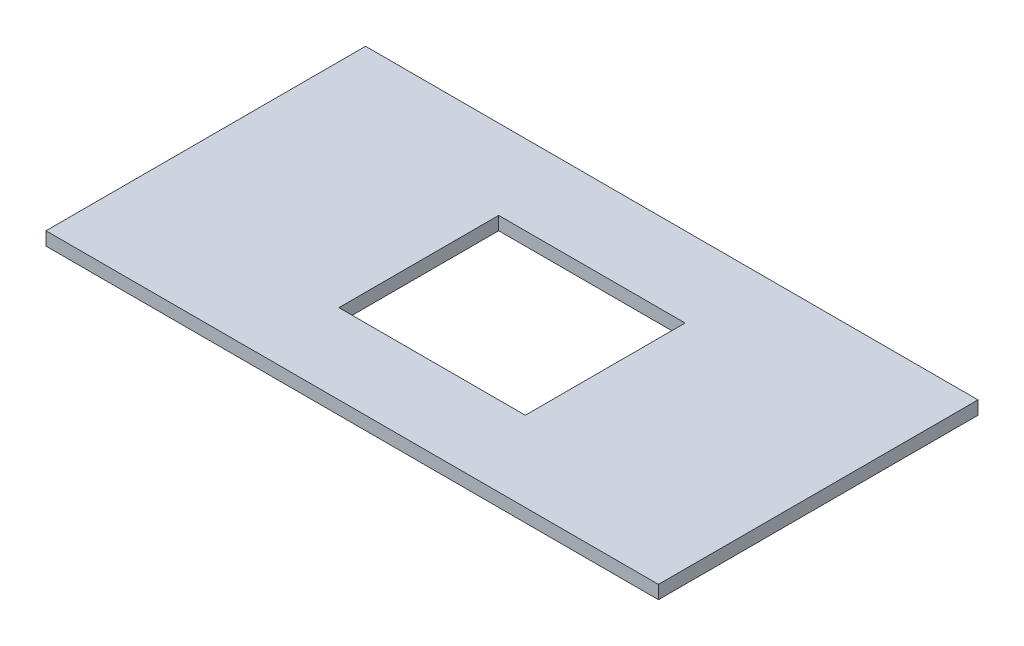
ISO-10303-21;
HEADER;
FILE_DESCRIPTION(('STEP AP214'),'2;1');
FILE_NAME('part.step','',(''),(''),'','','');
FILE_SCHEMA(('AUTOMOTIVE_DESIGN { 1 0 10303 214 1 1 1 1 }'));
ENDSEC;
DATA;
#1=APPLICATION_CONTEXT('core data for automotive mechanical design processes');
#2=APPLICATION_PROTOCOL_DEFINITION('international standard','automotive_design',2000,#1);
#3=PRODUCT_CONTEXT('',#1,'mechanical');
#4=PRODUCT('Part','Part','',(#3));
#5=PRODUCT_RELATED_PRODUCT_CATEGORY('part','',(#4));
#6=PRODUCT_DEFINITION_FORMATION('','',#4);
#7=PRODUCT_DEFINITION_CONTEXT('part definition',#1,'design');
#8=PRODUCT_DEFINITION('design','',#6,#7);
#9=PRODUCT_DEFINITION_SHAPE('','',#8);
#10=(LENGTH_UNIT() NAMED_UNIT(*) SI_UNIT(.MILLI.,.METRE.));
#11=(NAMED_UNIT(*) PLANE_ANGLE_UNIT() SI_UNIT($,.RADIAN.));
#12=(NAMED_UNIT(*) SI_UNIT($,.STERADIAN.) SOLID_ANGLE_UNIT());
#13=UNCERTAINTY_MEASURE_WITH_UNIT(LENGTH_MEASURE(1.E-05),#10,'distance_accuracy_value','');
#14=(GEOMETRIC_REPRESENTATION_CONTEXT(3) GLOBAL_UNCERTAINTY_ASSIGNED_CONTEXT((#13)) GLOBAL_UNIT_ASSIGNED_CONTEXT((#10,
#11,#12)) REPRESENTATION_CONTEXT('',''));
#15=CARTESIAN_POINT('',(0.,0.,0.));
#16=DIRECTION('',(0.,0.,1.));
#17=DIRECTION('',(1.,0.,0.));
#18=AXIS2_PLACEMENT_3D('',#15,#16,#17);
#19=CARTESIAN_POINT('',(0.,3.175,0.));
#20=DIRECTION('',(0.,-1.,0.));
#21=DIRECTION('',(0.,0.,-1.));
#22=AXIS2_PLACEMENT_3D('',#19,#20,#21);
#23=PLANE('',#22);
#24=DIRECTION('',(0.,0.,1.));
#25=VECTOR('',#24,1.);
#26=CARTESIAN_POINT('',(0.,3.175,0.));
#27=LINE('',#26,#25);
#28=CARTESIAN_POINT('',(0.,3.175,-76.2));
#29=VERTEX_POINT('',#28);
#30=CARTESIAN_POINT('',(0.,3.175,0.));
#31=VERTEX_POINT('',#30);
#32=EDGE_CURVE('E134',#29,#31,#27,.T.);
#33=ORIENTED_EDGE('',*,*,#32,.T.);
#34=DIRECTION('',(1.,0.,0.));
#35=VECTOR('',#34,1.);
#36=CARTESIAN_POINT('',(0.,3.175,0.));
#37=LINE('',#36,#35);
#38=CARTESIAN_POINT('',(146.05,3.175,0.));
#39=VERTEX_POINT('',#38);
#40=EDGE_CURVE('E137',#31,#39,#37,.T.);
#41=ORIENTED_EDGE('',*,*,#40,.T.);
#42=DIRECTION('',(0.,0.,-1.));
#43=VECTOR('',#42,1.);
#44=CARTESIAN_POINT('',(146.05,3.175,0.));
#45=LINE('',#44,#43);
#46=CARTESIAN_POINT('',(146.05,3.175,-76.2));
#47=VERTEX_POINT('',#46);
#48=EDGE_CURVE('E140',#39,#47,#45,.T.);
#49=ORIENTED_EDGE('',*,*,#48,.T.);
#50=DIRECTION('',(-1.,0.,0.));
#51=VECTOR('',#50,1.);
#52=CARTESIAN_POINT('',(0.,3.175,-76.2));
#53=LINE('',#52,#51);
#54=EDGE_CURVE('E142',#47,#29,#53,.T.);
#55=ORIENTED_EDGE('',*,*,#54,.T.);
#56=EDGE_LOOP('',(#33,#41,#49,#55));
#57=FACE_BOUND('',#56,.T.);
#58=DIRECTION('',(0.,0.,1.));
#59=VECTOR('',#58,1.);
#60=CARTESIAN_POINT('',(50.8,3.175,-19.05));
#61=LINE('',#60,#59);
#62=CARTESIAN_POINT('',(50.8,3.175,-57.15));
#63=VERTEX_POINT('',#62);
#64=CARTESIAN_POINT('',(50.8,3.175,-19.05));
#65=VERTEX_POINT('',#64);
#66=EDGE_CURVE('E98',#63,#65,#61,.T.);
#67=ORIENTED_EDGE('',*,*,#66,.F.);
#68=DIRECTION('',(-1.,0.,0.));
#69=VECTOR('',#68,1.);
#70=CARTESIAN_POINT('',(50.8,3.175,-57.15));
#71=LINE('',#70,#69);
#72=CARTESIAN_POINT('',(95.25,3.175,-57.15));
#73=VERTEX_POINT('',#72);
#74=EDGE_CURVE('E120',#73,#63,#71,.T.);
#75=ORIENTED_EDGE('',*,*,#74,.F.);
#76=DIRECTION('',(0.,0.,-1.));
#77=VECTOR('',#76,1.);
#78=CARTESIAN_POINT('',(95.25,3.175,-19.05));
#79=LINE('',#78,#77);
#80=CARTESIAN_POINT('',(95.25,3.175,-19.05));
#81=VERTEX_POINT('',#80);
#82=EDGE_CURVE('E118',#81,#73,#79,.T.);
#83=ORIENTED_EDGE('',*,*,#82,.F.);
#84=DIRECTION('',(1.,0.,0.));
#85=VECTOR('',#84,1.);
#86=CARTESIAN_POINT('',(50.8,3.175,-19.05));
#87=LINE('',#86,#85);
#88=EDGE_CURVE('E106',#65,#81,#87,.T.);
#89=ORIENTED_EDGE('',*,*,#88,.F.);
#90=EDGE_LOOP('',(#67,#75,#83,#89));
#91=FACE_BOUND('',#90,.T.);
#92=ADVANCED_FACE('F33',(#57,#91),#23,.F.);
#93=CARTESIAN_POINT('',(0.,0.,0.));
#94=DIRECTION('',(0.,-1.,0.));
#95=DIRECTION('',(0.,0.,-1.));
#96=AXIS2_PLACEMENT_3D('',#93,#94,#95);
#97=PLANE('',#96);
#98=DIRECTION('',(0.,0.,1.));
#99=VECTOR('',#98,1.);
#100=CARTESIAN_POINT('',(0.,0.,0.));
#101=LINE('',#100,#99);
#102=CARTESIAN_POINT('',(0.,0.,-76.2));
#103=VERTEX_POINT('',#102);
#104=CARTESIAN_POINT('',(0.,0.,0.));
#105=VERTEX_POINT('',#104);
#106=EDGE_CURVE('E114',#103,#105,#101,.T.);
#107=ORIENTED_EDGE('',*,*,#106,.F.);
#108=DIRECTION('',(-1.,0.,0.));
#109=VECTOR('',#108,1.);
#110=CARTESIAN_POINT('',(0.,0.,-76.2));
#111=LINE('',#110,#109);
#112=CARTESIAN_POINT('',(146.05,0.,-76.2));
#113=VERTEX_POINT('',#112);
#114=EDGE_CURVE('E138',#113,#103,#111,.T.);
#115=ORIENTED_EDGE('',*,*,#114,.F.);
#116=DIRECTION('',(0.,0.,-1.));
#117=VECTOR('',#116,1.);
#118=CARTESIAN_POINT('',(146.05,0.,0.));
#119=LINE('',#118,#117);
#120=CARTESIAN_POINT('',(146.05,0.,0.));
#121=VERTEX_POINT('',#120);
#122=EDGE_CURVE('E149',#121,#113,#119,.T.);
#123=ORIENTED_EDGE('',*,*,#122,.F.);
#124=DIRECTION('',(1.,0.,0.));
#125=VECTOR('',#124,1.);
#126=CARTESIAN_POINT('',(0.,0.,0.));
#127=LINE('',#126,#125);
#128=EDGE_CURVE('E147',#105,#121,#127,.T.);
#129=ORIENTED_EDGE('',*,*,#128,.F.);
#130=EDGE_LOOP('',(#107,#115,#123,#129));
#131=FACE_BOUND('',#130,.T.);
#132=DIRECTION('',(-1.,0.,0.));
#133=VECTOR('',#132,1.);
#134=CARTESIAN_POINT('',(50.8,0.,-57.15));
#135=LINE('',#134,#133);
#136=CARTESIAN_POINT('',(95.25,0.,-57.15));
#137=VERTEX_POINT('',#136);
#138=CARTESIAN_POINT('',(50.8,0.,-57.15));
#139=VERTEX_POINT('',#138);
#140=EDGE_CURVE('E107',#137,#139,#135,.T.);
#141=ORIENTED_EDGE('',*,*,#140,.T.);
#142=DIRECTION('',(0.,0.,1.));
#143=VECTOR('',#142,1.);
#144=CARTESIAN_POINT('',(50.8,0.,-19.05));
#145=LINE('',#144,#143);
#146=CARTESIAN_POINT('',(50.8,0.,-19.05));
#147=VERTEX_POINT('',#146);
#148=EDGE_CURVE('E56',#139,#147,#145,.T.);
#149=ORIENTED_EDGE('',*,*,#148,.T.);
#150=DIRECTION('',(1.,0.,0.));
#151=VECTOR('',#150,1.);
#152=CARTESIAN_POINT('',(50.8,0.,-19.05));
#153=LINE('',#152,#151);
#154=CARTESIAN_POINT('',(95.25,0.,-19.05));
#155=VERTEX_POINT('',#154);
#156=EDGE_CURVE('E113',#147,#155,#153,.T.);
#157=ORIENTED_EDGE('',*,*,#156,.T.);
#158=DIRECTION('',(0.,0.,-1.));
#159=VECTOR('',#158,1.);
#160=CARTESIAN_POINT('',(95.25,0.,-19.05));
#161=LINE('',#160,#159);
#162=EDGE_CURVE('E126',#155,#137,#161,.T.);
#163=ORIENTED_EDGE('',*,*,#162,.T.);
#164=EDGE_LOOP('',(#141,#149,#157,#163));
#165=FACE_BOUND('',#164,.T.);
#166=ADVANCED_FACE('F167',(#131,#165),#97,.T.);
#167=CARTESIAN_POINT('',(0.,3.175,0.));
#168=DIRECTION('',(1.,0.,0.));
#169=DIRECTION('',(0.,0.,-1.));
#170=AXIS2_PLACEMENT_3D('',#167,#168,#169);
#171=PLANE('',#170);
#172=ORIENTED_EDGE('',*,*,#106,.T.);
#173=DIRECTION('',(0.,-1.,0.));
#174=VECTOR('',#173,1.);
#175=CARTESIAN_POINT('',(0.,3.175,0.));
#176=LINE('',#175,#174);
#177=EDGE_CURVE('E11',#31,#105,#176,.T.);
#178=ORIENTED_EDGE('',*,*,#177,.F.);
#179=ORIENTED_EDGE('',*,*,#32,.F.);
#180=DIRECTION('',(0.,-1.,0.));
#181=VECTOR('',#180,1.);
#182=CARTESIAN_POINT('',(0.,3.175,-76.2));
#183=LINE('',#182,#181);
#184=EDGE_CURVE('E144',#29,#103,#183,.T.);
#185=ORIENTED_EDGE('',*,*,#184,.T.);
#186=EDGE_LOOP('',(#172,#178,#179,#185));
#187=FACE_BOUND('',#186,.T.);
#188=ADVANCED_FACE('F35',(#187),#171,.F.);
#189=CARTESIAN_POINT('',(0.,3.175,0.));
#190=DIRECTION('',(0.,0.,-1.));
#191=DIRECTION('',(-1.,0.,0.));
#192=AXIS2_PLACEMENT_3D('',#189,#190,#191);
#193=PLANE('',#192);
#194=ORIENTED_EDGE('',*,*,#128,.T.);
#195=DIRECTION('',(0.,-1.,0.));
#196=VECTOR('',#195,1.);
#197=CARTESIAN_POINT('',(146.05,3.175,0.));
#198=LINE('',#197,#196);
#199=EDGE_CURVE('E41',#39,#121,#198,.T.);
#200=ORIENTED_EDGE('',*,*,#199,.F.);
#201=ORIENTED_EDGE('',*,*,#40,.F.);
#202=ORIENTED_EDGE('',*,*,#177,.T.);
#203=EDGE_LOOP('',(#194,#200,#201,#202));
#204=FACE_BOUND('',#203,.T.);
#205=ADVANCED_FACE('F177',(#204),#193,.F.);
#206=CARTESIAN_POINT('',(146.05,3.175,0.));
#207=DIRECTION('',(-1.,0.,0.));
#208=DIRECTION('',(0.,0.,1.));
#209=AXIS2_PLACEMENT_3D('',#206,#207,#208);
#210=PLANE('',#209);
#211=ORIENTED_EDGE('',*,*,#122,.T.);
#212=DIRECTION('',(0.,-1.,0.));
#213=VECTOR('',#212,1.);
#214=CARTESIAN_POINT('',(146.05,3.175,-76.2));
#215=LINE('',#214,#213);
#216=EDGE_CURVE('E154',#47,#113,#215,.T.);
#217=ORIENTED_EDGE('',*,*,#216,.F.);
#218=ORIENTED_EDGE('',*,*,#48,.F.);
#219=ORIENTED_EDGE('',*,*,#199,.T.);
#220=EDGE_LOOP('',(#211,#217,#218,#219));
#221=FACE_BOUND('',#220,.T.);
#222=ADVANCED_FACE('F161',(#221),#210,.F.);
#223=CARTESIAN_POINT('',(0.,3.175,-76.2));
#224=DIRECTION('',(0.,0.,1.));
#225=DIRECTION('',(1.,0.,0.));
#226=AXIS2_PLACEMENT_3D('',#223,#224,#225);
#227=PLANE('',#226);
#228=ORIENTED_EDGE('',*,*,#114,.T.);
#229=ORIENTED_EDGE('',*,*,#184,.F.);
#230=ORIENTED_EDGE('',*,*,#54,.F.);
#231=ORIENTED_EDGE('',*,*,#216,.T.);
#232=EDGE_LOOP('',(#228,#229,#230,#231));
#233=FACE_BOUND('',#232,.T.);
#234=ADVANCED_FACE('F171',(#233),#227,.F.);
#235=CARTESIAN_POINT('',(50.8,3.175,-19.05));
#236=DIRECTION('',(1.,0.,0.));
#237=DIRECTION('',(0.,0.,-1.));
#238=AXIS2_PLACEMENT_3D('',#235,#236,#237);
#239=PLANE('',#238);
#240=ORIENTED_EDGE('',*,*,#148,.F.);
#241=DIRECTION('',(0.,-1.,0.));
#242=VECTOR('',#241,1.);
#243=CARTESIAN_POINT('',(50.8,3.175,-57.15));
#244=LINE('',#243,#242);
#245=EDGE_CURVE('E102',#63,#139,#244,.T.);
#246=ORIENTED_EDGE('',*,*,#245,.F.);
#247=ORIENTED_EDGE('',*,*,#66,.T.);
#248=DIRECTION('',(0.,-1.,0.));
#249=VECTOR('',#248,1.);
#250=CARTESIAN_POINT('',(50.8,3.175,-19.05));
#251=LINE('',#250,#249);
#252=EDGE_CURVE('E101',#65,#147,#251,.T.);
#253=ORIENTED_EDGE('',*,*,#252,.T.);
#254=EDGE_LOOP('',(#240,#246,#247,#253));
#255=FACE_BOUND('',#254,.T.);
#256=ADVANCED_FACE('F100',(#255),#239,.T.);
#257=CARTESIAN_POINT('',(50.8,3.175,-19.05));
#258=DIRECTION('',(0.,0.,-1.));
#259=DIRECTION('',(-1.,0.,0.));
#260=AXIS2_PLACEMENT_3D('',#257,#258,#259);
#261=PLANE('',#260);
#262=ORIENTED_EDGE('',*,*,#156,.F.);
#263=ORIENTED_EDGE('',*,*,#252,.F.);
#264=ORIENTED_EDGE('',*,*,#88,.T.);
#265=DIRECTION('',(0.,-1.,0.));
#266=VECTOR('',#265,1.);
#267=CARTESIAN_POINT('',(95.25,3.175,-19.05));
#268=LINE('',#267,#266);
#269=EDGE_CURVE('E115',#81,#155,#268,.T.);
#270=ORIENTED_EDGE('',*,*,#269,.T.);
#271=EDGE_LOOP('',(#262,#263,#264,#270));
#272=FACE_BOUND('',#271,.T.);
#273=ADVANCED_FACE('F110',(#272),#261,.T.);
#274=CARTESIAN_POINT('',(95.25,3.175,-19.05));
#275=DIRECTION('',(-1.,0.,0.));
#276=DIRECTION('',(0.,0.,1.));
#277=AXIS2_PLACEMENT_3D('',#274,#275,#276);
#278=PLANE('',#277);
#279=ORIENTED_EDGE('',*,*,#162,.F.);
#280=ORIENTED_EDGE('',*,*,#269,.F.);
#281=ORIENTED_EDGE('',*,*,#82,.T.);
#282=DIRECTION('',(0.,-1.,0.));
#283=VECTOR('',#282,1.);
#284=CARTESIAN_POINT('',(95.25,3.175,-57.15));
#285=LINE('',#284,#283);
#286=EDGE_CURVE('E48',#73,#137,#285,.T.);
#287=ORIENTED_EDGE('',*,*,#286,.T.);
#288=EDGE_LOOP('',(#279,#280,#281,#287));
#289=FACE_BOUND('',#288,.T.);
#290=ADVANCED_FACE('F200',(#289),#278,.T.);
#291=CARTESIAN_POINT('',(50.8,3.175,-57.15));
#292=DIRECTION('',(0.,0.,1.));
#293=DIRECTION('',(1.,0.,0.));
#294=AXIS2_PLACEMENT_3D('',#291,#292,#293);
#295=PLANE('',#294);
#296=ORIENTED_EDGE('',*,*,#140,.F.);
#297=ORIENTED_EDGE('',*,*,#286,.F.);
#298=ORIENTED_EDGE('',*,*,#74,.T.);
#299=ORIENTED_EDGE('',*,*,#245,.T.);
#300=EDGE_LOOP('',(#296,#297,#298,#299));
#301=FACE_BOUND('',#300,.T.);
#302=ADVANCED_FACE('F204',(#301),#295,.T.);
#303=CLOSED_SHELL('',(#92,#166,#188,#205,#222,#234,#256,#273,#290,#302));
#304=MANIFOLD_SOLID_BREP('B2',#303);
#305=ADVANCED_BREP_SHAPE_REPRESENTATION('',(#18,#304),#14);
#306=SHAPE_DEFINITION_REPRESENTATION(#9,#305);
ENDSEC;
END-ISO-10303-21;
